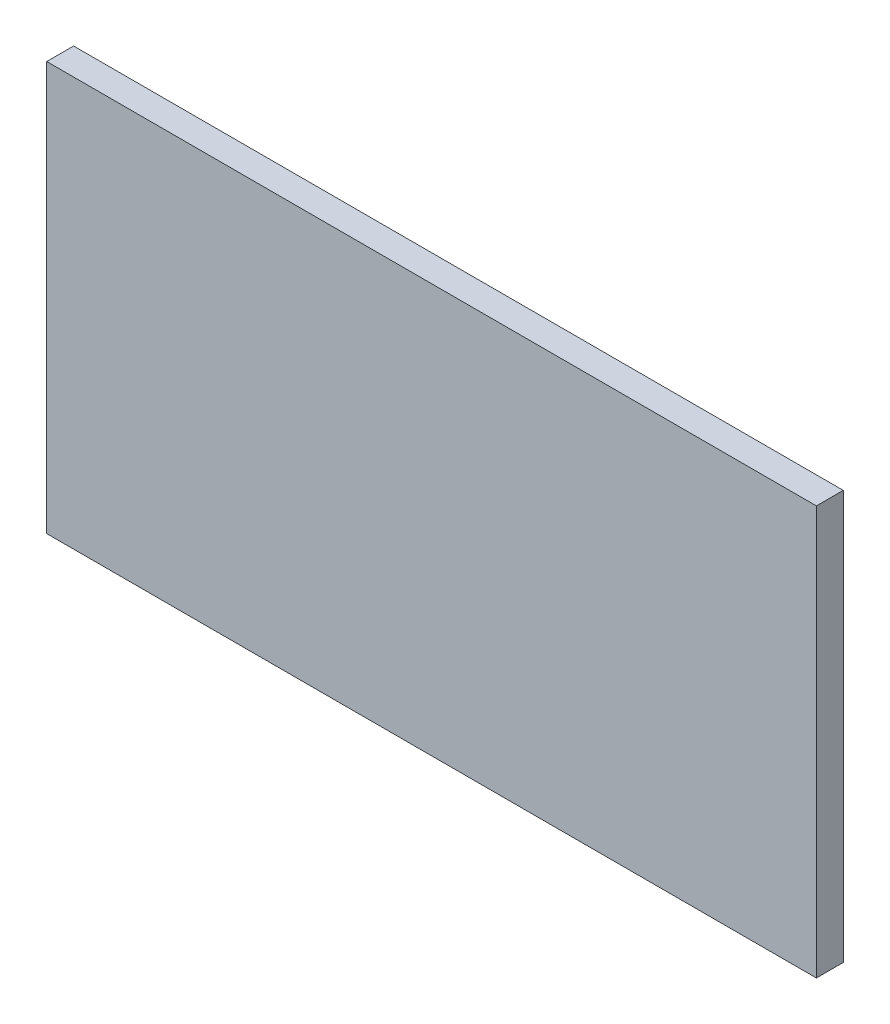
ISO-10303-21;
HEADER;
FILE_DESCRIPTION(('STEP AP214'),'2;1');
FILE_NAME('part.step','',(''),(''),'','','');
FILE_SCHEMA(('AUTOMOTIVE_DESIGN { 1 0 10303 214 1 1 1 1 }'));
ENDSEC;
DATA;
#1=APPLICATION_CONTEXT('core data for automotive mechanical design processes');
#2=APPLICATION_PROTOCOL_DEFINITION('international standard','automotive_design',2000,#1);
#3=PRODUCT_CONTEXT('',#1,'mechanical');
#4=PRODUCT('Part','Part','',(#3));
#5=PRODUCT_RELATED_PRODUCT_CATEGORY('part','',(#4));
#6=PRODUCT_DEFINITION_FORMATION('','',#4);
#7=PRODUCT_DEFINITION_CONTEXT('part definition',#1,'design');
#8=PRODUCT_DEFINITION('design','',#6,#7);
#9=PRODUCT_DEFINITION_SHAPE('','',#8);
#10=(LENGTH_UNIT() NAMED_UNIT(*) SI_UNIT(.MILLI.,.METRE.));
#11=(NAMED_UNIT(*) PLANE_ANGLE_UNIT() SI_UNIT($,.RADIAN.));
#12=(NAMED_UNIT(*) SI_UNIT($,.STERADIAN.) SOLID_ANGLE_UNIT());
#13=UNCERTAINTY_MEASURE_WITH_UNIT(LENGTH_MEASURE(1.E-05),#10,'distance_accuracy_value','');
#14=(GEOMETRIC_REPRESENTATION_CONTEXT(3) GLOBAL_UNCERTAINTY_ASSIGNED_CONTEXT((#13)) GLOBAL_UNIT_ASSIGNED_CONTEXT((#10,
#11,#12)) REPRESENTATION_CONTEXT('',''));
#15=CARTESIAN_POINT('',(0.,0.,0.));
#16=DIRECTION('',(0.,0.,1.));
#17=DIRECTION('',(1.,0.,0.));
#18=AXIS2_PLACEMENT_3D('',#15,#16,#17);
#19=CARTESIAN_POINT('',(-143.237135895803,76.0947284446455,10.));
#20=DIRECTION('',(1.,0.,0.));
#21=DIRECTION('',(0.,0.,-1.));
#22=AXIS2_PLACEMENT_3D('',#19,#20,#21);
#23=PLANE('',#22);
#24=DIRECTION('',(0.,-1.,0.));
#25=VECTOR('',#24,1.);
#26=CARTESIAN_POINT('',(-143.237135895803,76.0947284446455,0.));
#27=LINE('',#26,#25);
#28=CARTESIAN_POINT('',(-143.237135895803,76.0947284446455,0.));
#29=VERTEX_POINT('',#28);
#30=CARTESIAN_POINT('',(-143.237135895803,-76.0947284446455,0.));
#31=VERTEX_POINT('',#30);
#32=EDGE_CURVE('E100',#29,#31,#27,.T.);
#33=ORIENTED_EDGE('',*,*,#32,.T.);
#34=DIRECTION('',(0.,0.,-1.));
#35=VECTOR('',#34,1.);
#36=CARTESIAN_POINT('',(-143.237135895803,-76.0947284446455,10.));
#37=LINE('',#36,#35);
#38=CARTESIAN_POINT('',(-143.237135895803,-76.0947284446455,10.));
#39=VERTEX_POINT('',#38);
#40=EDGE_CURVE('E11',#39,#31,#37,.T.);
#41=ORIENTED_EDGE('',*,*,#40,.F.);
#42=DIRECTION('',(0.,-1.,0.));
#43=VECTOR('',#42,1.);
#44=CARTESIAN_POINT('',(-143.237135895803,76.0947284446455,10.));
#45=LINE('',#44,#43);
#46=CARTESIAN_POINT('',(-143.237135895803,76.0947284446455,10.));
#47=VERTEX_POINT('',#46);
#48=EDGE_CURVE('E88',#47,#39,#45,.T.);
#49=ORIENTED_EDGE('',*,*,#48,.F.);
#50=DIRECTION('',(0.,0.,-1.));
#51=VECTOR('',#50,1.);
#52=CARTESIAN_POINT('',(-143.237135895803,76.0947284446455,10.));
#53=LINE('',#52,#51);
#54=EDGE_CURVE('E96',#47,#29,#53,.T.);
#55=ORIENTED_EDGE('',*,*,#54,.T.);
#56=EDGE_LOOP('',(#33,#41,#49,#55));
#57=FACE_BOUND('',#56,.T.);
#58=ADVANCED_FACE('F37',(#57),#23,.F.);
#59=CARTESIAN_POINT('',(143.237135895803,-76.0947284446455,10.));
#60=DIRECTION('',(0.,1.,0.));
#61=DIRECTION('',(0.,0.,1.));
#62=AXIS2_PLACEMENT_3D('',#59,#60,#61);
#63=PLANE('',#62);
#64=DIRECTION('',(1.,0.,0.));
#65=VECTOR('',#64,1.);
#66=CARTESIAN_POINT('',(143.237135895803,-76.0947284446455,0.));
#67=LINE('',#66,#65);
#68=CARTESIAN_POINT('',(143.237135895803,-76.0947284446455,0.));
#69=VERTEX_POINT('',#68);
#70=EDGE_CURVE('E92',#31,#69,#67,.T.);
#71=ORIENTED_EDGE('',*,*,#70,.T.);
#72=DIRECTION('',(0.,0.,-1.));
#73=VECTOR('',#72,1.);
#74=CARTESIAN_POINT('',(143.237135895803,-76.0947284446455,10.));
#75=LINE('',#74,#73);
#76=CARTESIAN_POINT('',(143.237135895803,-76.0947284446455,10.));
#77=VERTEX_POINT('',#76);
#78=EDGE_CURVE('E45',#77,#69,#75,.T.);
#79=ORIENTED_EDGE('',*,*,#78,.F.);
#80=DIRECTION('',(1.,0.,0.));
#81=VECTOR('',#80,1.);
#82=CARTESIAN_POINT('',(143.237135895803,-76.0947284446455,10.));
#83=LINE('',#82,#81);
#84=EDGE_CURVE('E83',#39,#77,#83,.T.);
#85=ORIENTED_EDGE('',*,*,#84,.F.);
#86=ORIENTED_EDGE('',*,*,#40,.T.);
#87=EDGE_LOOP('',(#71,#79,#85,#86));
#88=FACE_BOUND('',#87,.T.);
#89=ADVANCED_FACE('F91',(#88),#63,.F.);
#90=CARTESIAN_POINT('',(143.237135895803,76.0947284446455,10.));
#91=DIRECTION('',(-1.,0.,0.));
#92=DIRECTION('',(0.,0.,1.));
#93=AXIS2_PLACEMENT_3D('',#90,#91,#92);
#94=PLANE('',#93);
#95=DIRECTION('',(0.,1.,0.));
#96=VECTOR('',#95,1.);
#97=CARTESIAN_POINT('',(143.237135895803,76.0947284446455,0.));
#98=LINE('',#97,#96);
#99=CARTESIAN_POINT('',(143.237135895803,76.0947284446455,0.));
#100=VERTEX_POINT('',#99);
#101=EDGE_CURVE('E70',#69,#100,#98,.T.);
#102=ORIENTED_EDGE('',*,*,#101,.T.);
#103=DIRECTION('',(0.,0.,-1.));
#104=VECTOR('',#103,1.);
#105=CARTESIAN_POINT('',(143.237135895803,76.0947284446455,10.));
#106=LINE('',#105,#104);
#107=CARTESIAN_POINT('',(143.237135895803,76.0947284446455,10.));
#108=VERTEX_POINT('',#107);
#109=EDGE_CURVE('E93',#108,#100,#106,.T.);
#110=ORIENTED_EDGE('',*,*,#109,.F.);
#111=DIRECTION('',(0.,1.,0.));
#112=VECTOR('',#111,1.);
#113=CARTESIAN_POINT('',(143.237135895803,76.0947284446455,10.));
#114=LINE('',#113,#112);
#115=EDGE_CURVE('E86',#77,#108,#114,.T.);
#116=ORIENTED_EDGE('',*,*,#115,.F.);
#117=ORIENTED_EDGE('',*,*,#78,.T.);
#118=EDGE_LOOP('',(#102,#110,#116,#117));
#119=FACE_BOUND('',#118,.T.);
#120=ADVANCED_FACE('F94',(#119),#94,.F.);
#121=CARTESIAN_POINT('',(143.237135895803,76.0947284446455,10.));
#122=DIRECTION('',(0.,-1.,0.));
#123=DIRECTION('',(0.,0.,-1.));
#124=AXIS2_PLACEMENT_3D('',#121,#122,#123);
#125=PLANE('',#124);
#126=DIRECTION('',(-1.,0.,0.));
#127=VECTOR('',#126,1.);
#128=CARTESIAN_POINT('',(143.237135895803,76.0947284446455,0.));
#129=LINE('',#128,#127);
#130=EDGE_CURVE('E76',#100,#29,#129,.T.);
#131=ORIENTED_EDGE('',*,*,#130,.T.);
#132=ORIENTED_EDGE('',*,*,#54,.F.);
#133=DIRECTION('',(-1.,0.,0.));
#134=VECTOR('',#133,1.);
#135=CARTESIAN_POINT('',(143.237135895803,76.0947284446455,10.));
#136=LINE('',#135,#134);
#137=EDGE_CURVE('E53',#108,#47,#136,.T.);
#138=ORIENTED_EDGE('',*,*,#137,.F.);
#139=ORIENTED_EDGE('',*,*,#109,.T.);
#140=EDGE_LOOP('',(#131,#132,#138,#139));
#141=FACE_BOUND('',#140,.T.);
#142=ADVANCED_FACE('F107',(#141),#125,.F.);
#143=CARTESIAN_POINT('',(0.,0.,10.));
#144=DIRECTION('',(0.,0.,-1.));
#145=DIRECTION('',(-1.,0.,0.));
#146=AXIS2_PLACEMENT_3D('',#143,#144,#145);
#147=PLANE('',#146);
#148=ORIENTED_EDGE('',*,*,#48,.T.);
#149=ORIENTED_EDGE('',*,*,#84,.T.);
#150=ORIENTED_EDGE('',*,*,#115,.T.);
#151=ORIENTED_EDGE('',*,*,#137,.T.);
#152=EDGE_LOOP('',(#148,#149,#150,#151));
#153=FACE_BOUND('',#152,.T.);
#154=ADVANCED_FACE('F84',(#153),#147,.F.);
#155=CARTESIAN_POINT('',(0.,0.,0.));
#156=DIRECTION('',(0.,0.,-1.));
#157=DIRECTION('',(-1.,0.,0.));
#158=AXIS2_PLACEMENT_3D('',#155,#156,#157);
#159=PLANE('',#158);
#160=ORIENTED_EDGE('',*,*,#32,.F.);
#161=ORIENTED_EDGE('',*,*,#130,.F.);
#162=ORIENTED_EDGE('',*,*,#101,.F.);
#163=ORIENTED_EDGE('',*,*,#70,.F.);
#164=EDGE_LOOP('',(#160,#161,#162,#163));
#165=FACE_BOUND('',#164,.T.);
#166=ADVANCED_FACE('F110',(#165),#159,.T.);
#167=CLOSED_SHELL('',(#58,#89,#120,#142,#154,#166));
#168=MANIFOLD_SOLID_BREP('B2',#167);
#169=ADVANCED_BREP_SHAPE_REPRESENTATION('',(#18,#168),#14);
#170=SHAPE_DEFINITION_REPRESENTATION(#9,#169);
ENDSEC;
END-ISO-10303-21;
